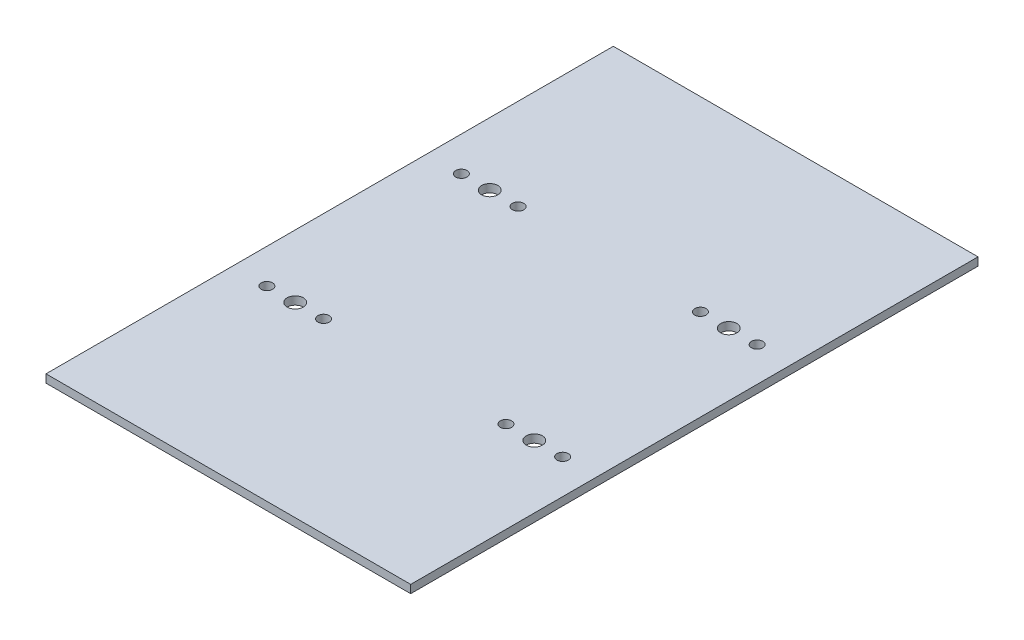
ISO-10303-21;
HEADER;
FILE_DESCRIPTION(('STEP AP214'),'2;1');
FILE_NAME('part.step','',(''),(''),'','','');
FILE_SCHEMA(('AUTOMOTIVE_DESIGN { 1 0 10303 214 1 1 1 1 }'));
ENDSEC;
DATA;
#1=APPLICATION_CONTEXT('core data for automotive mechanical design processes');
#2=APPLICATION_PROTOCOL_DEFINITION('international standard','automotive_design',2000,#1);
#3=PRODUCT_CONTEXT('',#1,'mechanical');
#4=PRODUCT('Part','Part','',(#3));
#5=PRODUCT_RELATED_PRODUCT_CATEGORY('part','',(#4));
#6=PRODUCT_DEFINITION_FORMATION('','',#4);
#7=PRODUCT_DEFINITION_CONTEXT('part definition',#1,'design');
#8=PRODUCT_DEFINITION('design','',#6,#7);
#9=PRODUCT_DEFINITION_SHAPE('','',#8);
#10=(LENGTH_UNIT() NAMED_UNIT(*) SI_UNIT(.MILLI.,.METRE.));
#11=(NAMED_UNIT(*) PLANE_ANGLE_UNIT() SI_UNIT($,.RADIAN.));
#12=(NAMED_UNIT(*) SI_UNIT($,.STERADIAN.) SOLID_ANGLE_UNIT());
#13=UNCERTAINTY_MEASURE_WITH_UNIT(LENGTH_MEASURE(1.E-05),#10,'distance_accuracy_value','');
#14=(GEOMETRIC_REPRESENTATION_CONTEXT(3) GLOBAL_UNCERTAINTY_ASSIGNED_CONTEXT((#13)) GLOBAL_UNIT_ASSIGNED_CONTEXT((#10,
#11,#12)) REPRESENTATION_CONTEXT('',''));
#15=CARTESIAN_POINT('',(0.,0.,0.));
#16=DIRECTION('',(0.,0.,1.));
#17=DIRECTION('',(1.,0.,0.));
#18=AXIS2_PLACEMENT_3D('',#15,#16,#17);
#19=CARTESIAN_POINT('',(0.,2.,0.));
#20=DIRECTION('',(0.,-1.,0.));
#21=DIRECTION('',(0.,0.,-1.));
#22=AXIS2_PLACEMENT_3D('',#19,#20,#21);
#23=PLANE('',#22);
#24=DIRECTION('',(0.,0.,-1.));
#25=VECTOR('',#24,1.);
#26=CARTESIAN_POINT('',(45.,2.,70.));
#27=LINE('',#26,#25);
#28=CARTESIAN_POINT('',(45.,2.,70.));
#29=VERTEX_POINT('',#28);
#30=CARTESIAN_POINT('',(45.,2.,-70.));
#31=VERTEX_POINT('',#30);
#32=EDGE_CURVE('E85',#29,#31,#27,.T.);
#33=ORIENTED_EDGE('',*,*,#32,.T.);
#34=DIRECTION('',(-1.,0.,0.));
#35=VECTOR('',#34,1.);
#36=CARTESIAN_POINT('',(-45.,2.,-70.));
#37=LINE('',#36,#35);
#38=CARTESIAN_POINT('',(-45.,2.,-70.));
#39=VERTEX_POINT('',#38);
#40=EDGE_CURVE('E80',#31,#39,#37,.T.);
#41=ORIENTED_EDGE('',*,*,#40,.T.);
#42=DIRECTION('',(0.,0.,1.));
#43=VECTOR('',#42,1.);
#44=CARTESIAN_POINT('',(-45.,2.,70.));
#45=LINE('',#44,#43);
#46=CARTESIAN_POINT('',(-45.,2.,70.));
#47=VERTEX_POINT('',#46);
#48=EDGE_CURVE('E83',#39,#47,#45,.T.);
#49=ORIENTED_EDGE('',*,*,#48,.T.);
#50=DIRECTION('',(1.,0.,0.));
#51=VECTOR('',#50,1.);
#52=CARTESIAN_POINT('',(-45.,2.,70.));
#53=LINE('',#52,#51);
#54=EDGE_CURVE('E50',#47,#29,#53,.T.);
#55=ORIENTED_EDGE('',*,*,#54,.T.);
#56=EDGE_LOOP('',(#33,#41,#49,#55));
#57=FACE_BOUND('',#56,.T.);
#58=CARTESIAN_POINT('',(-29.5,2.,-24.));
#59=DIRECTION('',(0.,1.,0.));
#60=DIRECTION('',(0.,0.,1.));
#61=AXIS2_PLACEMENT_3D('',#58,#59,#60);
#62=CIRCLE('',#61,2.);
#63=CARTESIAN_POINT('',(-29.5,2.,-22.));
#64=VERTEX_POINT('',#63);
#65=EDGE_CURVE('E100',#64,#64,#62,.T.);
#66=ORIENTED_EDGE('',*,*,#65,.F.);
#67=EDGE_LOOP('',(#66));
#68=FACE_BOUND('',#67,.T.);
#69=CARTESIAN_POINT('',(-36.5,2.,-24.));
#70=DIRECTION('',(0.,1.,0.));
#71=DIRECTION('',(0.,0.,1.));
#72=AXIS2_PLACEMENT_3D('',#69,#70,#71);
#73=CIRCLE('',#72,1.4);
#74=CARTESIAN_POINT('',(-36.5,2.,-22.6));
#75=VERTEX_POINT('',#74);
#76=EDGE_CURVE('E115',#75,#75,#73,.T.);
#77=ORIENTED_EDGE('',*,*,#76,.F.);
#78=EDGE_LOOP('',(#77));
#79=FACE_BOUND('',#78,.T.);
#80=CARTESIAN_POINT('',(-22.5,2.,-24.));
#81=DIRECTION('',(0.,1.,0.));
#82=DIRECTION('',(0.,0.,1.));
#83=AXIS2_PLACEMENT_3D('',#80,#81,#82);
#84=CIRCLE('',#83,1.4);
#85=CARTESIAN_POINT('',(-22.5,2.,-22.6));
#86=VERTEX_POINT('',#85);
#87=EDGE_CURVE('E121',#86,#86,#84,.T.);
#88=ORIENTED_EDGE('',*,*,#87,.F.);
#89=EDGE_LOOP('',(#88));
#90=FACE_BOUND('',#89,.T.);
#91=CARTESIAN_POINT('',(22.5,2.,-24.));
#92=DIRECTION('',(0.,1.,0.));
#93=DIRECTION('',(0.,0.,-1.));
#94=AXIS2_PLACEMENT_3D('',#91,#92,#93);
#95=CIRCLE('',#94,1.4);
#96=CARTESIAN_POINT('',(22.5,2.,-25.4));
#97=VERTEX_POINT('',#96);
#98=EDGE_CURVE('E127',#97,#97,#95,.T.);
#99=ORIENTED_EDGE('',*,*,#98,.F.);
#100=EDGE_LOOP('',(#99));
#101=FACE_BOUND('',#100,.T.);
#102=CARTESIAN_POINT('',(29.5,2.,-24.));
#103=DIRECTION('',(0.,1.,0.));
#104=DIRECTION('',(0.,0.,-1.));
#105=AXIS2_PLACEMENT_3D('',#102,#103,#104);
#106=CIRCLE('',#105,2.);
#107=CARTESIAN_POINT('',(29.5,2.,-26.));
#108=VERTEX_POINT('',#107);
#109=EDGE_CURVE('E133',#108,#108,#106,.T.);
#110=ORIENTED_EDGE('',*,*,#109,.F.);
#111=EDGE_LOOP('',(#110));
#112=FACE_BOUND('',#111,.T.);
#113=CARTESIAN_POINT('',(36.5,2.,-24.));
#114=DIRECTION('',(0.,1.,0.));
#115=DIRECTION('',(0.,0.,-1.));
#116=AXIS2_PLACEMENT_3D('',#113,#114,#115);
#117=CIRCLE('',#116,1.4);
#118=CARTESIAN_POINT('',(36.5,2.,-25.4));
#119=VERTEX_POINT('',#118);
#120=EDGE_CURVE('E139',#119,#119,#117,.T.);
#121=ORIENTED_EDGE('',*,*,#120,.F.);
#122=EDGE_LOOP('',(#121));
#123=FACE_BOUND('',#122,.T.);
#124=CARTESIAN_POINT('',(36.4999999999999,2.,24.));
#125=DIRECTION('',(0.,1.,0.));
#126=DIRECTION('',(0.,0.,1.));
#127=AXIS2_PLACEMENT_3D('',#124,#125,#126);
#128=CIRCLE('',#127,1.4);
#129=CARTESIAN_POINT('',(36.4999999999999,2.,25.4));
#130=VERTEX_POINT('',#129);
#131=EDGE_CURVE('E145',#130,#130,#128,.T.);
#132=ORIENTED_EDGE('',*,*,#131,.F.);
#133=EDGE_LOOP('',(#132));
#134=FACE_BOUND('',#133,.T.);
#135=CARTESIAN_POINT('',(29.4999999999999,2.,24.));
#136=DIRECTION('',(0.,1.,0.));
#137=DIRECTION('',(0.,0.,1.));
#138=AXIS2_PLACEMENT_3D('',#135,#136,#137);
#139=CIRCLE('',#138,2.);
#140=CARTESIAN_POINT('',(29.4999999999999,2.,26.));
#141=VERTEX_POINT('',#140);
#142=EDGE_CURVE('E151',#141,#141,#139,.T.);
#143=ORIENTED_EDGE('',*,*,#142,.F.);
#144=EDGE_LOOP('',(#143));
#145=FACE_BOUND('',#144,.T.);
#146=CARTESIAN_POINT('',(22.4999999999999,2.,24.));
#147=DIRECTION('',(0.,1.,0.));
#148=DIRECTION('',(0.,0.,1.));
#149=AXIS2_PLACEMENT_3D('',#146,#147,#148);
#150=CIRCLE('',#149,1.4);
#151=CARTESIAN_POINT('',(22.4999999999999,2.,25.4));
#152=VERTEX_POINT('',#151);
#153=EDGE_CURVE('E157',#152,#152,#150,.T.);
#154=ORIENTED_EDGE('',*,*,#153,.F.);
#155=EDGE_LOOP('',(#154));
#156=FACE_BOUND('',#155,.T.);
#157=CARTESIAN_POINT('',(-22.5,2.,24.));
#158=DIRECTION('',(0.,1.,0.));
#159=DIRECTION('',(0.,0.,-1.));
#160=AXIS2_PLACEMENT_3D('',#157,#158,#159);
#161=CIRCLE('',#160,1.4);
#162=CARTESIAN_POINT('',(-22.5,2.,22.6));
#163=VERTEX_POINT('',#162);
#164=EDGE_CURVE('E163',#163,#163,#161,.T.);
#165=ORIENTED_EDGE('',*,*,#164,.F.);
#166=EDGE_LOOP('',(#165));
#167=FACE_BOUND('',#166,.T.);
#168=CARTESIAN_POINT('',(-29.5,2.,24.));
#169=DIRECTION('',(0.,1.,0.));
#170=DIRECTION('',(0.,0.,-1.));
#171=AXIS2_PLACEMENT_3D('',#168,#169,#170);
#172=CIRCLE('',#171,2.);
#173=CARTESIAN_POINT('',(-29.5,2.,22.));
#174=VERTEX_POINT('',#173);
#175=EDGE_CURVE('E169',#174,#174,#172,.T.);
#176=ORIENTED_EDGE('',*,*,#175,.F.);
#177=EDGE_LOOP('',(#176));
#178=FACE_BOUND('',#177,.T.);
#179=CARTESIAN_POINT('',(-36.5,2.,24.));
#180=DIRECTION('',(0.,1.,0.));
#181=DIRECTION('',(0.,0.,-1.));
#182=AXIS2_PLACEMENT_3D('',#179,#180,#181);
#183=CIRCLE('',#182,1.4);
#184=CARTESIAN_POINT('',(-36.5,2.,22.6));
#185=VERTEX_POINT('',#184);
#186=EDGE_CURVE('E175',#185,#185,#183,.T.);
#187=ORIENTED_EDGE('',*,*,#186,.F.);
#188=EDGE_LOOP('',(#187));
#189=FACE_BOUND('',#188,.T.);
#190=ADVANCED_FACE('F33',(#57,#68,#79,#90,#101,#112,#123,#134,#145,#156,#167,#178,#189),#23,.F.);
#191=CARTESIAN_POINT('',(0.,0.,0.));
#192=DIRECTION('',(0.,-1.,0.));
#193=DIRECTION('',(0.,0.,-1.));
#194=AXIS2_PLACEMENT_3D('',#191,#192,#193);
#195=PLANE('',#194);
#196=CARTESIAN_POINT('',(-29.5,0.,24.));
#197=DIRECTION('',(0.,1.,0.));
#198=DIRECTION('',(0.,0.,-1.));
#199=AXIS2_PLACEMENT_3D('',#196,#197,#198);
#200=CIRCLE('',#199,2.);
#201=CARTESIAN_POINT('',(-29.5,0.,22.));
#202=VERTEX_POINT('',#201);
#203=EDGE_CURVE('E172',#202,#202,#200,.T.);
#204=ORIENTED_EDGE('',*,*,#203,.T.);
#205=EDGE_LOOP('',(#204));
#206=FACE_BOUND('',#205,.T.);
#207=CARTESIAN_POINT('',(22.4999999999999,0.,24.));
#208=DIRECTION('',(0.,1.,0.));
#209=DIRECTION('',(0.,0.,1.));
#210=AXIS2_PLACEMENT_3D('',#207,#208,#209);
#211=CIRCLE('',#210,1.4);
#212=CARTESIAN_POINT('',(22.4999999999999,0.,25.4));
#213=VERTEX_POINT('',#212);
#214=EDGE_CURVE('E160',#213,#213,#211,.T.);
#215=ORIENTED_EDGE('',*,*,#214,.T.);
#216=EDGE_LOOP('',(#215));
#217=FACE_BOUND('',#216,.T.);
#218=CARTESIAN_POINT('',(36.4999999999999,0.,24.));
#219=DIRECTION('',(0.,1.,0.));
#220=DIRECTION('',(0.,0.,1.));
#221=AXIS2_PLACEMENT_3D('',#218,#219,#220);
#222=CIRCLE('',#221,1.4);
#223=CARTESIAN_POINT('',(36.4999999999999,0.,25.4));
#224=VERTEX_POINT('',#223);
#225=EDGE_CURVE('E148',#224,#224,#222,.T.);
#226=ORIENTED_EDGE('',*,*,#225,.T.);
#227=EDGE_LOOP('',(#226));
#228=FACE_BOUND('',#227,.T.);
#229=CARTESIAN_POINT('',(29.5,0.,-24.));
#230=DIRECTION('',(0.,1.,0.));
#231=DIRECTION('',(0.,0.,-1.));
#232=AXIS2_PLACEMENT_3D('',#229,#230,#231);
#233=CIRCLE('',#232,2.);
#234=CARTESIAN_POINT('',(29.5,0.,-26.));
#235=VERTEX_POINT('',#234);
#236=EDGE_CURVE('E136',#235,#235,#233,.T.);
#237=ORIENTED_EDGE('',*,*,#236,.T.);
#238=EDGE_LOOP('',(#237));
#239=FACE_BOUND('',#238,.T.);
#240=CARTESIAN_POINT('',(-22.5,0.,-24.));
#241=DIRECTION('',(0.,1.,0.));
#242=DIRECTION('',(0.,0.,1.));
#243=AXIS2_PLACEMENT_3D('',#240,#241,#242);
#244=CIRCLE('',#243,1.4);
#245=CARTESIAN_POINT('',(-22.5,0.,-22.6));
#246=VERTEX_POINT('',#245);
#247=EDGE_CURVE('E124',#246,#246,#244,.T.);
#248=ORIENTED_EDGE('',*,*,#247,.T.);
#249=EDGE_LOOP('',(#248));
#250=FACE_BOUND('',#249,.T.);
#251=CARTESIAN_POINT('',(-29.5,0.,-24.));
#252=DIRECTION('',(0.,1.,0.));
#253=DIRECTION('',(0.,0.,1.));
#254=AXIS2_PLACEMENT_3D('',#251,#252,#253);
#255=CIRCLE('',#254,2.);
#256=CARTESIAN_POINT('',(-29.5,0.,-22.));
#257=VERTEX_POINT('',#256);
#258=EDGE_CURVE('E112',#257,#257,#255,.T.);
#259=ORIENTED_EDGE('',*,*,#258,.T.);
#260=EDGE_LOOP('',(#259));
#261=FACE_BOUND('',#260,.T.);
#262=DIRECTION('',(0.,0.,-1.));
#263=VECTOR('',#262,1.);
#264=CARTESIAN_POINT('',(45.,0.,70.));
#265=LINE('',#264,#263);
#266=CARTESIAN_POINT('',(45.,0.,70.));
#267=VERTEX_POINT('',#266);
#268=CARTESIAN_POINT('',(45.,0.,-70.));
#269=VERTEX_POINT('',#268);
#270=EDGE_CURVE('E97',#267,#269,#265,.T.);
#271=ORIENTED_EDGE('',*,*,#270,.F.);
#272=DIRECTION('',(1.,0.,0.));
#273=VECTOR('',#272,1.);
#274=CARTESIAN_POINT('',(-45.,0.,70.));
#275=LINE('',#274,#273);
#276=CARTESIAN_POINT('',(-45.,0.,70.));
#277=VERTEX_POINT('',#276);
#278=EDGE_CURVE('E73',#277,#267,#275,.T.);
#279=ORIENTED_EDGE('',*,*,#278,.F.);
#280=DIRECTION('',(0.,0.,1.));
#281=VECTOR('',#280,1.);
#282=CARTESIAN_POINT('',(-45.,0.,70.));
#283=LINE('',#282,#281);
#284=CARTESIAN_POINT('',(-45.,0.,-70.));
#285=VERTEX_POINT('',#284);
#286=EDGE_CURVE('E67',#285,#277,#283,.T.);
#287=ORIENTED_EDGE('',*,*,#286,.F.);
#288=DIRECTION('',(-1.,0.,0.));
#289=VECTOR('',#288,1.);
#290=CARTESIAN_POINT('',(-45.,0.,-70.));
#291=LINE('',#290,#289);
#292=EDGE_CURVE('E89',#269,#285,#291,.T.);
#293=ORIENTED_EDGE('',*,*,#292,.F.);
#294=EDGE_LOOP('',(#271,#279,#287,#293));
#295=FACE_BOUND('',#294,.T.);
#296=CARTESIAN_POINT('',(-36.5,0.,-24.));
#297=DIRECTION('',(0.,1.,0.));
#298=DIRECTION('',(0.,0.,1.));
#299=AXIS2_PLACEMENT_3D('',#296,#297,#298);
#300=CIRCLE('',#299,1.4);
#301=CARTESIAN_POINT('',(-36.5,0.,-22.6));
#302=VERTEX_POINT('',#301);
#303=EDGE_CURVE('E118',#302,#302,#300,.T.);
#304=ORIENTED_EDGE('',*,*,#303,.T.);
#305=EDGE_LOOP('',(#304));
#306=FACE_BOUND('',#305,.T.);
#307=CARTESIAN_POINT('',(22.5,0.,-24.));
#308=DIRECTION('',(0.,1.,0.));
#309=DIRECTION('',(0.,0.,-1.));
#310=AXIS2_PLACEMENT_3D('',#307,#308,#309);
#311=CIRCLE('',#310,1.4);
#312=CARTESIAN_POINT('',(22.5,0.,-25.4));
#313=VERTEX_POINT('',#312);
#314=EDGE_CURVE('E130',#313,#313,#311,.T.);
#315=ORIENTED_EDGE('',*,*,#314,.T.);
#316=EDGE_LOOP('',(#315));
#317=FACE_BOUND('',#316,.T.);
#318=CARTESIAN_POINT('',(36.5,0.,-24.));
#319=DIRECTION('',(0.,1.,0.));
#320=DIRECTION('',(0.,0.,-1.));
#321=AXIS2_PLACEMENT_3D('',#318,#319,#320);
#322=CIRCLE('',#321,1.4);
#323=CARTESIAN_POINT('',(36.5,0.,-25.4));
#324=VERTEX_POINT('',#323);
#325=EDGE_CURVE('E142',#324,#324,#322,.T.);
#326=ORIENTED_EDGE('',*,*,#325,.T.);
#327=EDGE_LOOP('',(#326));
#328=FACE_BOUND('',#327,.T.);
#329=CARTESIAN_POINT('',(29.4999999999999,0.,24.));
#330=DIRECTION('',(0.,1.,0.));
#331=DIRECTION('',(0.,0.,1.));
#332=AXIS2_PLACEMENT_3D('',#329,#330,#331);
#333=CIRCLE('',#332,2.);
#334=CARTESIAN_POINT('',(29.4999999999999,0.,26.));
#335=VERTEX_POINT('',#334);
#336=EDGE_CURVE('E154',#335,#335,#333,.T.);
#337=ORIENTED_EDGE('',*,*,#336,.T.);
#338=EDGE_LOOP('',(#337));
#339=FACE_BOUND('',#338,.T.);
#340=CARTESIAN_POINT('',(-22.5,0.,24.));
#341=DIRECTION('',(0.,1.,0.));
#342=DIRECTION('',(0.,0.,-1.));
#343=AXIS2_PLACEMENT_3D('',#340,#341,#342);
#344=CIRCLE('',#343,1.4);
#345=CARTESIAN_POINT('',(-22.5,0.,22.6));
#346=VERTEX_POINT('',#345);
#347=EDGE_CURVE('E166',#346,#346,#344,.T.);
#348=ORIENTED_EDGE('',*,*,#347,.T.);
#349=EDGE_LOOP('',(#348));
#350=FACE_BOUND('',#349,.T.);
#351=CARTESIAN_POINT('',(-36.5,0.,24.));
#352=DIRECTION('',(0.,1.,0.));
#353=DIRECTION('',(0.,0.,-1.));
#354=AXIS2_PLACEMENT_3D('',#351,#352,#353);
#355=CIRCLE('',#354,1.4);
#356=CARTESIAN_POINT('',(-36.5,0.,22.6));
#357=VERTEX_POINT('',#356);
#358=EDGE_CURVE('E178',#357,#357,#355,.T.);
#359=ORIENTED_EDGE('',*,*,#358,.T.);
#360=EDGE_LOOP('',(#359));
#361=FACE_BOUND('',#360,.T.);
#362=ADVANCED_FACE('F108',(#206,#217,#228,#239,#250,#261,#295,#306,#317,#328,#339,#350,#361),
#195,.T.);
#363=CARTESIAN_POINT('',(45.,2.,70.));
#364=DIRECTION('',(-1.,0.,0.));
#365=DIRECTION('',(0.,0.,1.));
#366=AXIS2_PLACEMENT_3D('',#363,#364,#365);
#367=PLANE('',#366);
#368=ORIENTED_EDGE('',*,*,#270,.T.);
#369=DIRECTION('',(0.,-1.,0.));
#370=VECTOR('',#369,1.);
#371=CARTESIAN_POINT('',(45.,2.,-70.));
#372=LINE('',#371,#370);
#373=EDGE_CURVE('E11',#31,#269,#372,.T.);
#374=ORIENTED_EDGE('',*,*,#373,.F.);
#375=ORIENTED_EDGE('',*,*,#32,.F.);
#376=DIRECTION('',(0.,-1.,0.));
#377=VECTOR('',#376,1.);
#378=CARTESIAN_POINT('',(45.,2.,70.));
#379=LINE('',#378,#377);
#380=EDGE_CURVE('E93',#29,#267,#379,.T.);
#381=ORIENTED_EDGE('',*,*,#380,.T.);
#382=EDGE_LOOP('',(#368,#374,#375,#381));
#383=FACE_BOUND('',#382,.T.);
#384=ADVANCED_FACE('F35',(#383),#367,.F.);
#385=CARTESIAN_POINT('',(-45.,2.,-70.));
#386=DIRECTION('',(0.,0.,1.));
#387=DIRECTION('',(1.,0.,0.));
#388=AXIS2_PLACEMENT_3D('',#385,#386,#387);
#389=PLANE('',#388);
#390=ORIENTED_EDGE('',*,*,#292,.T.);
#391=DIRECTION('',(0.,-1.,0.));
#392=VECTOR('',#391,1.);
#393=CARTESIAN_POINT('',(-45.,2.,-70.));
#394=LINE('',#393,#392);
#395=EDGE_CURVE('E42',#39,#285,#394,.T.);
#396=ORIENTED_EDGE('',*,*,#395,.F.);
#397=ORIENTED_EDGE('',*,*,#40,.F.);
#398=ORIENTED_EDGE('',*,*,#373,.T.);
#399=EDGE_LOOP('',(#390,#396,#397,#398));
#400=FACE_BOUND('',#399,.T.);
#401=ADVANCED_FACE('F88',(#400),#389,.F.);
#402=CARTESIAN_POINT('',(-45.,2.,70.));
#403=DIRECTION('',(1.,0.,0.));
#404=DIRECTION('',(0.,0.,-1.));
#405=AXIS2_PLACEMENT_3D('',#402,#403,#404);
#406=PLANE('',#405);
#407=ORIENTED_EDGE('',*,*,#286,.T.);
#408=DIRECTION('',(0.,-1.,0.));
#409=VECTOR('',#408,1.);
#410=CARTESIAN_POINT('',(-45.,2.,70.));
#411=LINE('',#410,#409);
#412=EDGE_CURVE('E90',#47,#277,#411,.T.);
#413=ORIENTED_EDGE('',*,*,#412,.F.);
#414=ORIENTED_EDGE('',*,*,#48,.F.);
#415=ORIENTED_EDGE('',*,*,#395,.T.);
#416=EDGE_LOOP('',(#407,#413,#414,#415));
#417=FACE_BOUND('',#416,.T.);
#418=ADVANCED_FACE('F91',(#417),#406,.F.);
#419=CARTESIAN_POINT('',(-45.,2.,70.));
#420=DIRECTION('',(0.,0.,-1.));
#421=DIRECTION('',(-1.,0.,0.));
#422=AXIS2_PLACEMENT_3D('',#419,#420,#421);
#423=PLANE('',#422);
#424=ORIENTED_EDGE('',*,*,#278,.T.);
#425=ORIENTED_EDGE('',*,*,#380,.F.);
#426=ORIENTED_EDGE('',*,*,#54,.F.);
#427=ORIENTED_EDGE('',*,*,#412,.T.);
#428=EDGE_LOOP('',(#424,#425,#426,#427));
#429=FACE_BOUND('',#428,.T.);
#430=ADVANCED_FACE('F105',(#429),#423,.F.);
#431=CARTESIAN_POINT('',(-29.5,2.,-24.));
#432=DIRECTION('',(0.,-1.,0.));
#433=DIRECTION('',(0.,0.,-1.));
#434=AXIS2_PLACEMENT_3D('',#431,#432,#433);
#435=CYLINDRICAL_SURFACE('',#434,2.);
#436=ORIENTED_EDGE('',*,*,#65,.T.);
#437=EDGE_LOOP('',(#436));
#438=FACE_BOUND('',#437,.T.);
#439=ORIENTED_EDGE('',*,*,#258,.F.);
#440=EDGE_LOOP('',(#439));
#441=FACE_BOUND('',#440,.T.);
#442=ADVANCED_FACE('F195',(#438,#441),#435,.F.);
#443=CARTESIAN_POINT('',(-36.5,2.,-24.));
#444=DIRECTION('',(0.,-1.,0.));
#445=DIRECTION('',(0.,0.,-1.));
#446=AXIS2_PLACEMENT_3D('',#443,#444,#445);
#447=CYLINDRICAL_SURFACE('',#446,1.4);
#448=ORIENTED_EDGE('',*,*,#76,.T.);
#449=EDGE_LOOP('',(#448));
#450=FACE_BOUND('',#449,.T.);
#451=ORIENTED_EDGE('',*,*,#303,.F.);
#452=EDGE_LOOP('',(#451));
#453=FACE_BOUND('',#452,.T.);
#454=ADVANCED_FACE('F241',(#450,#453),#447,.F.);
#455=CARTESIAN_POINT('',(-22.5,2.,-24.));
#456=DIRECTION('',(0.,-1.,0.));
#457=DIRECTION('',(0.,0.,-1.));
#458=AXIS2_PLACEMENT_3D('',#455,#456,#457);
#459=CYLINDRICAL_SURFACE('',#458,1.4);
#460=ORIENTED_EDGE('',*,*,#87,.T.);
#461=EDGE_LOOP('',(#460));
#462=FACE_BOUND('',#461,.T.);
#463=ORIENTED_EDGE('',*,*,#247,.F.);
#464=EDGE_LOOP('',(#463));
#465=FACE_BOUND('',#464,.T.);
#466=ADVANCED_FACE('F249',(#462,#465),#459,.F.);
#467=CARTESIAN_POINT('',(22.5,2.,-24.));
#468=DIRECTION('',(0.,-1.,0.));
#469=DIRECTION('',(0.,0.,-1.));
#470=AXIS2_PLACEMENT_3D('',#467,#468,#469);
#471=CYLINDRICAL_SURFACE('',#470,1.4);
#472=ORIENTED_EDGE('',*,*,#98,.T.);
#473=EDGE_LOOP('',(#472));
#474=FACE_BOUND('',#473,.T.);
#475=ORIENTED_EDGE('',*,*,#314,.F.);
#476=EDGE_LOOP('',(#475));
#477=FACE_BOUND('',#476,.T.);
#478=ADVANCED_FACE('F257',(#474,#477),#471,.F.);
#479=CARTESIAN_POINT('',(29.5,2.,-24.));
#480=DIRECTION('',(0.,-1.,0.));
#481=DIRECTION('',(0.,0.,-1.));
#482=AXIS2_PLACEMENT_3D('',#479,#480,#481);
#483=CYLINDRICAL_SURFACE('',#482,2.);
#484=ORIENTED_EDGE('',*,*,#109,.T.);
#485=EDGE_LOOP('',(#484));
#486=FACE_BOUND('',#485,.T.);
#487=ORIENTED_EDGE('',*,*,#236,.F.);
#488=EDGE_LOOP('',(#487));
#489=FACE_BOUND('',#488,.T.);
#490=ADVANCED_FACE('F266',(#486,#489),#483,.F.);
#491=CARTESIAN_POINT('',(36.5,2.,-24.));
#492=DIRECTION('',(0.,-1.,0.));
#493=DIRECTION('',(0.,0.,-1.));
#494=AXIS2_PLACEMENT_3D('',#491,#492,#493);
#495=CYLINDRICAL_SURFACE('',#494,1.4);
#496=ORIENTED_EDGE('',*,*,#120,.T.);
#497=EDGE_LOOP('',(#496));
#498=FACE_BOUND('',#497,.T.);
#499=ORIENTED_EDGE('',*,*,#325,.F.);
#500=EDGE_LOOP('',(#499));
#501=FACE_BOUND('',#500,.T.);
#502=ADVANCED_FACE('F275',(#498,#501),#495,.F.);
#503=CARTESIAN_POINT('',(36.4999999999999,2.,24.));
#504=DIRECTION('',(0.,-1.,0.));
#505=DIRECTION('',(0.,0.,-1.));
#506=AXIS2_PLACEMENT_3D('',#503,#504,#505);
#507=CYLINDRICAL_SURFACE('',#506,1.4);
#508=ORIENTED_EDGE('',*,*,#131,.T.);
#509=EDGE_LOOP('',(#508));
#510=FACE_BOUND('',#509,.T.);
#511=ORIENTED_EDGE('',*,*,#225,.F.);
#512=EDGE_LOOP('',(#511));
#513=FACE_BOUND('',#512,.T.);
#514=ADVANCED_FACE('F284',(#510,#513),#507,.F.);
#515=CARTESIAN_POINT('',(29.4999999999999,2.,24.));
#516=DIRECTION('',(0.,-1.,0.));
#517=DIRECTION('',(0.,0.,-1.));
#518=AXIS2_PLACEMENT_3D('',#515,#516,#517);
#519=CYLINDRICAL_SURFACE('',#518,2.);
#520=ORIENTED_EDGE('',*,*,#142,.T.);
#521=EDGE_LOOP('',(#520));
#522=FACE_BOUND('',#521,.T.);
#523=ORIENTED_EDGE('',*,*,#336,.F.);
#524=EDGE_LOOP('',(#523));
#525=FACE_BOUND('',#524,.T.);
#526=ADVANCED_FACE('F293',(#522,#525),#519,.F.);
#527=CARTESIAN_POINT('',(22.4999999999999,2.,24.));
#528=DIRECTION('',(0.,-1.,0.));
#529=DIRECTION('',(0.,0.,-1.));
#530=AXIS2_PLACEMENT_3D('',#527,#528,#529);
#531=CYLINDRICAL_SURFACE('',#530,1.4);
#532=ORIENTED_EDGE('',*,*,#153,.T.);
#533=EDGE_LOOP('',(#532));
#534=FACE_BOUND('',#533,.T.);
#535=ORIENTED_EDGE('',*,*,#214,.F.);
#536=EDGE_LOOP('',(#535));
#537=FACE_BOUND('',#536,.T.);
#538=ADVANCED_FACE('F302',(#534,#537),#531,.F.);
#539=CARTESIAN_POINT('',(-22.5,2.,24.));
#540=DIRECTION('',(0.,-1.,0.));
#541=DIRECTION('',(0.,0.,-1.));
#542=AXIS2_PLACEMENT_3D('',#539,#540,#541);
#543=CYLINDRICAL_SURFACE('',#542,1.4);
#544=ORIENTED_EDGE('',*,*,#164,.T.);
#545=EDGE_LOOP('',(#544));
#546=FACE_BOUND('',#545,.T.);
#547=ORIENTED_EDGE('',*,*,#347,.F.);
#548=EDGE_LOOP('',(#547));
#549=FACE_BOUND('',#548,.T.);
#550=ADVANCED_FACE('F311',(#546,#549),#543,.F.);
#551=CARTESIAN_POINT('',(-29.5,2.,24.));
#552=DIRECTION('',(0.,-1.,0.));
#553=DIRECTION('',(0.,0.,-1.));
#554=AXIS2_PLACEMENT_3D('',#551,#552,#553);
#555=CYLINDRICAL_SURFACE('',#554,2.);
#556=ORIENTED_EDGE('',*,*,#175,.T.);
#557=EDGE_LOOP('',(#556));
#558=FACE_BOUND('',#557,.T.);
#559=ORIENTED_EDGE('',*,*,#203,.F.);
#560=EDGE_LOOP('',(#559));
#561=FACE_BOUND('',#560,.T.);
#562=ADVANCED_FACE('F320',(#558,#561),#555,.F.);
#563=CARTESIAN_POINT('',(-36.5,2.,24.));
#564=DIRECTION('',(0.,-1.,0.));
#565=DIRECTION('',(0.,0.,-1.));
#566=AXIS2_PLACEMENT_3D('',#563,#564,#565);
#567=CYLINDRICAL_SURFACE('',#566,1.4);
#568=ORIENTED_EDGE('',*,*,#186,.T.);
#569=EDGE_LOOP('',(#568));
#570=FACE_BOUND('',#569,.T.);
#571=ORIENTED_EDGE('',*,*,#358,.F.);
#572=EDGE_LOOP('',(#571));
#573=FACE_BOUND('',#572,.T.);
#574=ADVANCED_FACE('F184',(#570,#573),#567,.F.);
#575=CLOSED_SHELL('',(#190,#362,#384,#401,#418,#430,#442,#454,#466,#478,#490,#502,#514,#526,
#538,#550,#562,#574));
#576=MANIFOLD_SOLID_BREP('B2',#575);
#577=ADVANCED_BREP_SHAPE_REPRESENTATION('',(#18,#576),#14);
#578=SHAPE_DEFINITION_REPRESENTATION(#9,#577);
ENDSEC;
END-ISO-10303-21;
